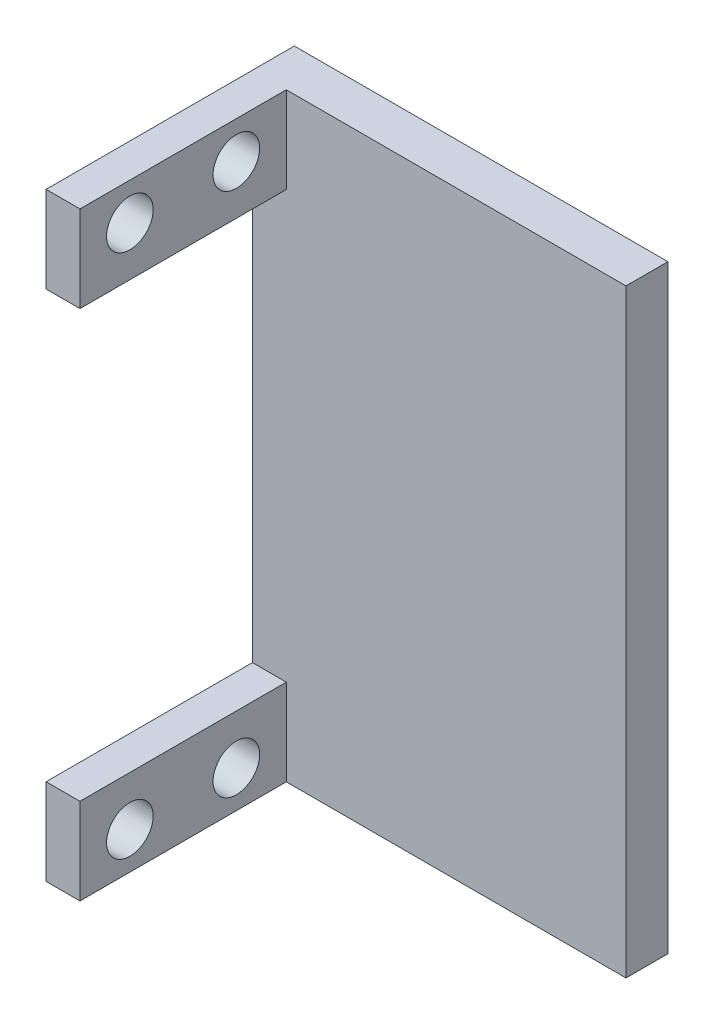
ISO-10303-21;
HEADER;
FILE_DESCRIPTION(('STEP AP214'),'2;1');
FILE_NAME('part.step','',(''),(''),'','','');
FILE_SCHEMA(('AUTOMOTIVE_DESIGN { 1 0 10303 214 1 1 1 1 }'));
ENDSEC;
DATA;
#1=APPLICATION_CONTEXT('core data for automotive mechanical design processes');
#2=APPLICATION_PROTOCOL_DEFINITION('international standard','automotive_design',2000,#1);
#3=PRODUCT_CONTEXT('',#1,'mechanical');
#4=PRODUCT('Part','Part','',(#3));
#5=PRODUCT_RELATED_PRODUCT_CATEGORY('part','',(#4));
#6=PRODUCT_DEFINITION_FORMATION('','',#4);
#7=PRODUCT_DEFINITION_CONTEXT('part definition',#1,'design');
#8=PRODUCT_DEFINITION('design','',#6,#7);
#9=PRODUCT_DEFINITION_SHAPE('','',#8);
#10=(LENGTH_UNIT() NAMED_UNIT(*) SI_UNIT(.MILLI.,.METRE.));
#11=(NAMED_UNIT(*) PLANE_ANGLE_UNIT() SI_UNIT($,.RADIAN.));
#12=(NAMED_UNIT(*) SI_UNIT($,.STERADIAN.) SOLID_ANGLE_UNIT());
#13=UNCERTAINTY_MEASURE_WITH_UNIT(LENGTH_MEASURE(1.E-05),#10,'distance_accuracy_value','');
#14=(GEOMETRIC_REPRESENTATION_CONTEXT(3) GLOBAL_UNCERTAINTY_ASSIGNED_CONTEXT((#13)) GLOBAL_UNIT_ASSIGNED_CONTEXT((#10,
#11,#12)) REPRESENTATION_CONTEXT('',''));
#15=CARTESIAN_POINT('',(0.,0.,0.));
#16=DIRECTION('',(0.,0.,1.));
#17=DIRECTION('',(1.,0.,0.));
#18=AXIS2_PLACEMENT_3D('',#15,#16,#17);
#19=CARTESIAN_POINT('',(0.,0.,2.));
#20=DIRECTION('',(0.,0.,1.));
#21=DIRECTION('',(1.,0.,0.));
#22=AXIS2_PLACEMENT_3D('',#19,#20,#21);
#23=PLANE('',#22);
#24=DIRECTION('',(0.,-1.,0.));
#25=VECTOR('',#24,1.);
#26=CARTESIAN_POINT('',(-15.3066683861169,28.6371621095774,2.));
#27=LINE('',#26,#25);
#28=CARTESIAN_POINT('',(-15.3066683861169,21.3981621095774,2.));
#29=VERTEX_POINT('',#28);
#30=CARTESIAN_POINT('',(-15.3066683861169,-19.3018378904226,2.));
#31=VERTEX_POINT('',#30);
#32=EDGE_CURVE('E49',#29,#31,#27,.T.);
#33=ORIENTED_EDGE('',*,*,#32,.T.);
#34=DIRECTION('',(-1.,0.,0.));
#35=VECTOR('',#34,1.);
#36=CARTESIAN_POINT('',(-15.3066683861169,-19.3018378904226,2.));
#37=LINE('',#36,#35);
#38=CARTESIAN_POINT('',(-12.075803956034,-19.3018378904226,2.));
#39=VERTEX_POINT('',#38);
#40=EDGE_CURVE('E57',#39,#31,#37,.T.);
#41=ORIENTED_EDGE('',*,*,#40,.F.);
#42=DIRECTION('',(0.,1.,0.));
#43=VECTOR('',#42,1.);
#44=CARTESIAN_POINT('',(-12.075803956034,-26.5408378904226,2.));
#45=LINE('',#44,#43);
#46=CARTESIAN_POINT('',(-12.075803956034,-27.5408378904226,2.));
#47=VERTEX_POINT('',#46);
#48=EDGE_CURVE('E204',#47,#39,#45,.T.);
#49=ORIENTED_EDGE('',*,*,#48,.F.);
#50=DIRECTION('',(-1.,0.,0.));
#51=VECTOR('',#50,1.);
#52=CARTESIAN_POINT('',(20.3293316138831,-27.5408378904226,2.));
#53=LINE('',#52,#51);
#54=CARTESIAN_POINT('',(20.3293316138831,-27.5408378904226,2.));
#55=VERTEX_POINT('',#54);
#56=EDGE_CURVE('E166',#55,#47,#53,.T.);
#57=ORIENTED_EDGE('',*,*,#56,.F.);
#58=DIRECTION('',(0.,1.,0.));
#59=VECTOR('',#58,1.);
#60=CARTESIAN_POINT('',(20.3293316138831,28.6371621095774,2.));
#61=LINE('',#60,#59);
#62=CARTESIAN_POINT('',(20.3293316138831,29.6371621095774,2.));
#63=VERTEX_POINT('',#62);
#64=EDGE_CURVE('E11',#55,#63,#61,.T.);
#65=ORIENTED_EDGE('',*,*,#64,.T.);
#66=DIRECTION('',(1.,0.,0.));
#67=VECTOR('',#66,1.);
#68=CARTESIAN_POINT('',(-12.075803956034,29.6371621095774,2.));
#69=LINE('',#68,#67);
#70=CARTESIAN_POINT('',(-12.075803956034,29.6371621095774,2.));
#71=VERTEX_POINT('',#70);
#72=EDGE_CURVE('E142',#71,#63,#69,.T.);
#73=ORIENTED_EDGE('',*,*,#72,.F.);
#74=DIRECTION('',(0.,1.,0.));
#75=VECTOR('',#74,1.);
#76=CARTESIAN_POINT('',(-12.075803956034,28.6371621095774,2.));
#77=LINE('',#76,#75);
#78=CARTESIAN_POINT('',(-12.075803956034,21.3981621095774,2.));
#79=VERTEX_POINT('',#78);
#80=EDGE_CURVE('E234',#79,#71,#77,.T.);
#81=ORIENTED_EDGE('',*,*,#80,.F.);
#82=DIRECTION('',(1.,0.,0.));
#83=VECTOR('',#82,1.);
#84=CARTESIAN_POINT('',(-15.3066683861169,21.3981621095774,2.));
#85=LINE('',#84,#83);
#86=EDGE_CURVE('E203',#29,#79,#85,.T.);
#87=ORIENTED_EDGE('',*,*,#86,.F.);
#88=EDGE_LOOP('',(#33,#41,#49,#57,#65,#73,#81,#87));
#89=FACE_BOUND('',#88,.T.);
#90=ADVANCED_FACE('F39',(#89),#23,.T.);
#91=CARTESIAN_POINT('',(-15.3066683861169,28.6371621095774,2.));
#92=DIRECTION('',(1.,0.,0.));
#93=DIRECTION('',(0.,1.,0.));
#94=AXIS2_PLACEMENT_3D('',#91,#92,#93);
#95=PLANE('',#94);
#96=CARTESIAN_POINT('',(-15.3066683861169,-24.0008378904226,16.9225));
#97=DIRECTION('',(-1.,0.,0.));
#98=DIRECTION('',(0.,-1.,0.));
#99=AXIS2_PLACEMENT_3D('',#96,#97,#98);
#100=CIRCLE('',#99,2.2225);
#101=CARTESIAN_POINT('',(-15.3066683861169,-26.2233378904226,16.9225));
#102=VERTEX_POINT('',#101);
#103=EDGE_CURVE('E183',#102,#102,#100,.T.);
#104=ORIENTED_EDGE('',*,*,#103,.F.);
#105=EDGE_LOOP('',(#104));
#106=FACE_BOUND('',#105,.T.);
#107=CARTESIAN_POINT('',(-15.3066683861169,26.0971621095774,6.76249999999999));
#108=DIRECTION('',(-1.,0.,0.));
#109=DIRECTION('',(0.,-1.,0.));
#110=AXIS2_PLACEMENT_3D('',#107,#108,#109);
#111=CIRCLE('',#110,2.2225);
#112=CARTESIAN_POINT('',(-15.3066683861169,23.8746621095774,6.76249999999999));
#113=VERTEX_POINT('',#112);
#114=EDGE_CURVE('E182',#113,#113,#111,.T.);
#115=ORIENTED_EDGE('',*,*,#114,.F.);
#116=EDGE_LOOP('',(#115));
#117=FACE_BOUND('',#116,.T.);
#118=CARTESIAN_POINT('',(-15.3066683861169,-24.0008378904226,6.76249999999999));
#119=DIRECTION('',(-1.,0.,0.));
#120=DIRECTION('',(0.,-1.,0.));
#121=AXIS2_PLACEMENT_3D('',#118,#119,#120);
#122=CIRCLE('',#121,2.2225);
#123=CARTESIAN_POINT('',(-15.3066683861169,-26.2233378904226,6.76249999999999));
#124=VERTEX_POINT('',#123);
#125=EDGE_CURVE('E178',#124,#124,#122,.T.);
#126=ORIENTED_EDGE('',*,*,#125,.F.);
#127=EDGE_LOOP('',(#126));
#128=FACE_BOUND('',#127,.T.);
#129=CARTESIAN_POINT('',(-15.3066683861169,26.0971621095774,16.9225));
#130=DIRECTION('',(-1.,0.,0.));
#131=DIRECTION('',(0.,-1.,0.));
#132=AXIS2_PLACEMENT_3D('',#129,#130,#131);
#133=CIRCLE('',#132,2.2225);
#134=CARTESIAN_POINT('',(-15.3066683861169,23.8746621095774,16.9225));
#135=VERTEX_POINT('',#134);
#136=EDGE_CURVE('E187',#135,#135,#133,.T.);
#137=ORIENTED_EDGE('',*,*,#136,.F.);
#138=EDGE_LOOP('',(#137));
#139=FACE_BOUND('',#138,.T.);
#140=DIRECTION('',(0.,-1.,0.));
#141=VECTOR('',#140,1.);
#142=CARTESIAN_POINT('',(-15.3066683861169,28.6371621095774,-2.));
#143=LINE('',#142,#141);
#144=CARTESIAN_POINT('',(-15.3066683861169,29.6371621095774,-2.));
#145=VERTEX_POINT('',#144);
#146=CARTESIAN_POINT('',(-15.3066683861169,-27.5408378904226,-2.));
#147=VERTEX_POINT('',#146);
#148=EDGE_CURVE('E127',#145,#147,#143,.T.);
#149=ORIENTED_EDGE('',*,*,#148,.T.);
#150=DIRECTION('',(0.,0.,-1.));
#151=VECTOR('',#150,1.);
#152=CARTESIAN_POINT('',(-15.3066683861169,-27.5408378904226,21.685));
#153=LINE('',#152,#151);
#154=CARTESIAN_POINT('',(-15.3066683861169,-27.5408378904226,21.685));
#155=VERTEX_POINT('',#154);
#156=EDGE_CURVE('E157',#155,#147,#153,.T.);
#157=ORIENTED_EDGE('',*,*,#156,.F.);
#158=DIRECTION('',(0.,1.,0.));
#159=VECTOR('',#158,1.);
#160=CARTESIAN_POINT('',(-15.3066683861169,-26.5408378904226,21.685));
#161=LINE('',#160,#159);
#162=CARTESIAN_POINT('',(-15.3066683861169,-19.3018378904226,21.685));
#163=VERTEX_POINT('',#162);
#164=EDGE_CURVE('E198',#155,#163,#161,.T.);
#165=ORIENTED_EDGE('',*,*,#164,.T.);
#166=DIRECTION('',(0.,0.,-1.));
#167=VECTOR('',#166,1.);
#168=CARTESIAN_POINT('',(-15.3066683861169,-19.3018378904226,29.6122697674278));
#169=LINE('',#168,#167);
#170=EDGE_CURVE('E210',#163,#31,#169,.T.);
#171=ORIENTED_EDGE('',*,*,#170,.T.);
#172=ORIENTED_EDGE('',*,*,#32,.F.);
#173=DIRECTION('',(0.,0.,-1.));
#174=VECTOR('',#173,1.);
#175=CARTESIAN_POINT('',(-15.3066683861169,21.3981621095774,29.6122697674278));
#176=LINE('',#175,#174);
#177=CARTESIAN_POINT('',(-15.3066683861169,21.3981621095774,21.685));
#178=VERTEX_POINT('',#177);
#179=EDGE_CURVE('E224',#178,#29,#176,.T.);
#180=ORIENTED_EDGE('',*,*,#179,.F.);
#181=DIRECTION('',(0.,1.,0.));
#182=VECTOR('',#181,1.);
#183=CARTESIAN_POINT('',(-15.3066683861169,28.6371621095774,21.685));
#184=LINE('',#183,#182);
#185=CARTESIAN_POINT('',(-15.3066683861169,29.6371621095774,21.685));
#186=VERTEX_POINT('',#185);
#187=EDGE_CURVE('E228',#178,#186,#184,.T.);
#188=ORIENTED_EDGE('',*,*,#187,.T.);
#189=DIRECTION('',(0.,0.,1.));
#190=VECTOR('',#189,1.);
#191=CARTESIAN_POINT('',(-15.3066683861169,29.6371621095774,-2.));
#192=LINE('',#191,#190);
#193=EDGE_CURVE('E136',#145,#186,#192,.T.);
#194=ORIENTED_EDGE('',*,*,#193,.F.);
#195=EDGE_LOOP('',(#149,#157,#165,#171,#172,#180,#188,#194));
#196=FACE_BOUND('',#195,.T.);
#197=ADVANCED_FACE('F41',(#106,#117,#128,#139,#196),#95,.F.);
#198=CARTESIAN_POINT('',(20.3293316138831,28.6371621095774,2.));
#199=DIRECTION('',(-1.,0.,0.));
#200=DIRECTION('',(0.,-1.,0.));
#201=AXIS2_PLACEMENT_3D('',#198,#199,#200);
#202=PLANE('',#201);
#203=DIRECTION('',(0.,1.,0.));
#204=VECTOR('',#203,1.);
#205=CARTESIAN_POINT('',(20.3293316138831,28.6371621095774,-2.));
#206=LINE('',#205,#204);
#207=CARTESIAN_POINT('',(20.3293316138831,-27.5408378904226,-2.));
#208=VERTEX_POINT('',#207);
#209=CARTESIAN_POINT('',(20.3293316138831,29.6371621095774,-2.));
#210=VERTEX_POINT('',#209);
#211=EDGE_CURVE('E116',#208,#210,#206,.T.);
#212=ORIENTED_EDGE('',*,*,#211,.T.);
#213=DIRECTION('',(0.,0.,-1.));
#214=VECTOR('',#213,1.);
#215=CARTESIAN_POINT('',(20.3293316138831,29.6371621095774,2.));
#216=LINE('',#215,#214);
#217=EDGE_CURVE('E120',#63,#210,#216,.T.);
#218=ORIENTED_EDGE('',*,*,#217,.F.);
#219=ORIENTED_EDGE('',*,*,#64,.F.);
#220=DIRECTION('',(0.,0.,1.));
#221=VECTOR('',#220,1.);
#222=CARTESIAN_POINT('',(20.3293316138831,-27.5408378904226,-2.));
#223=LINE('',#222,#221);
#224=EDGE_CURVE('E122',#208,#55,#223,.T.);
#225=ORIENTED_EDGE('',*,*,#224,.F.);
#226=EDGE_LOOP('',(#212,#218,#219,#225));
#227=FACE_BOUND('',#226,.T.);
#228=ADVANCED_FACE('F118',(#227),#202,.F.);
#229=CARTESIAN_POINT('',(0.,0.,-2.));
#230=DIRECTION('',(0.,0.,1.));
#231=DIRECTION('',(1.,0.,0.));
#232=AXIS2_PLACEMENT_3D('',#229,#230,#231);
#233=PLANE('',#232);
#234=ORIENTED_EDGE('',*,*,#148,.F.);
#235=DIRECTION('',(-1.,0.,0.));
#236=VECTOR('',#235,1.);
#237=CARTESIAN_POINT('',(20.3293316138831,29.6371621095774,-2.));
#238=LINE('',#237,#236);
#239=EDGE_CURVE('E130',#210,#145,#238,.T.);
#240=ORIENTED_EDGE('',*,*,#239,.F.);
#241=ORIENTED_EDGE('',*,*,#211,.F.);
#242=DIRECTION('',(1.,0.,0.));
#243=VECTOR('',#242,1.);
#244=CARTESIAN_POINT('',(-15.3066683861169,-27.5408378904226,-2.));
#245=LINE('',#244,#243);
#246=EDGE_CURVE('E161',#147,#208,#245,.T.);
#247=ORIENTED_EDGE('',*,*,#246,.F.);
#248=EDGE_LOOP('',(#234,#240,#241,#247));
#249=FACE_BOUND('',#248,.T.);
#250=ADVANCED_FACE('F131',(#249),#233,.F.);
#251=CARTESIAN_POINT('',(-12.075803956034,28.6371621095774,29.6122697674278));
#252=DIRECTION('',(-1.,0.,0.));
#253=DIRECTION('',(0.,0.,1.));
#254=AXIS2_PLACEMENT_3D('',#251,#252,#253);
#255=PLANE('',#254);
#256=CARTESIAN_POINT('',(-12.075803956034,26.0971621095774,6.76249999999999));
#257=DIRECTION('',(-1.,0.,0.));
#258=DIRECTION('',(0.,0.,1.));
#259=AXIS2_PLACEMENT_3D('',#256,#257,#258);
#260=CIRCLE('',#259,2.2225);
#261=CARTESIAN_POINT('',(-12.075803956034,26.0971621095774,8.98499999999999));
#262=VERTEX_POINT('',#261);
#263=EDGE_CURVE('E43',#262,#262,#260,.T.);
#264=ORIENTED_EDGE('',*,*,#263,.T.);
#265=EDGE_LOOP('',(#264));
#266=FACE_BOUND('',#265,.T.);
#267=CARTESIAN_POINT('',(-12.075803956034,26.0971621095774,16.9225));
#268=DIRECTION('',(-1.,0.,0.));
#269=DIRECTION('',(0.,0.,1.));
#270=AXIS2_PLACEMENT_3D('',#267,#268,#269);
#271=CIRCLE('',#270,2.2225);
#272=CARTESIAN_POINT('',(-12.075803956034,26.0971621095774,19.145));
#273=VERTEX_POINT('',#272);
#274=EDGE_CURVE('E254',#273,#273,#271,.T.);
#275=ORIENTED_EDGE('',*,*,#274,.T.);
#276=EDGE_LOOP('',(#275));
#277=FACE_BOUND('',#276,.T.);
#278=ORIENTED_EDGE('',*,*,#80,.T.);
#279=DIRECTION('',(0.,0.,-1.));
#280=VECTOR('',#279,1.);
#281=CARTESIAN_POINT('',(-12.075803956034,29.6371621095774,21.685));
#282=LINE('',#281,#280);
#283=CARTESIAN_POINT('',(-12.075803956034,29.6371621095774,21.685));
#284=VERTEX_POINT('',#283);
#285=EDGE_CURVE('E152',#284,#71,#282,.T.);
#286=ORIENTED_EDGE('',*,*,#285,.F.);
#287=DIRECTION('',(0.,-1.,0.));
#288=VECTOR('',#287,1.);
#289=CARTESIAN_POINT('',(-12.075803956034,28.6371621095774,21.685));
#290=LINE('',#289,#288);
#291=CARTESIAN_POINT('',(-12.075803956034,21.3981621095774,21.685));
#292=VERTEX_POINT('',#291);
#293=EDGE_CURVE('E219',#284,#292,#290,.T.);
#294=ORIENTED_EDGE('',*,*,#293,.T.);
#295=DIRECTION('',(0.,0.,-1.));
#296=VECTOR('',#295,1.);
#297=CARTESIAN_POINT('',(-12.075803956034,21.3981621095774,29.6122697674278));
#298=LINE('',#297,#296);
#299=EDGE_CURVE('E237',#292,#79,#298,.T.);
#300=ORIENTED_EDGE('',*,*,#299,.T.);
#301=EDGE_LOOP('',(#278,#286,#294,#300));
#302=FACE_BOUND('',#301,.T.);
#303=ADVANCED_FACE('F263',(#266,#277,#302),#255,.F.);
#304=CARTESIAN_POINT('',(-15.3066683861169,21.3981621095774,29.6122697674278));
#305=DIRECTION('',(0.,1.,0.));
#306=DIRECTION('',(0.,0.,1.));
#307=AXIS2_PLACEMENT_3D('',#304,#305,#306);
#308=PLANE('',#307);
#309=ORIENTED_EDGE('',*,*,#299,.F.);
#310=DIRECTION('',(-1.,0.,0.));
#311=VECTOR('',#310,1.);
#312=CARTESIAN_POINT('',(-15.3066683861169,21.3981621095774,21.685));
#313=LINE('',#312,#311);
#314=EDGE_CURVE('E223',#292,#178,#313,.T.);
#315=ORIENTED_EDGE('',*,*,#314,.T.);
#316=ORIENTED_EDGE('',*,*,#179,.T.);
#317=ORIENTED_EDGE('',*,*,#86,.T.);
#318=EDGE_LOOP('',(#309,#315,#316,#317));
#319=FACE_BOUND('',#318,.T.);
#320=ADVANCED_FACE('F289',(#319),#308,.F.);
#321=CARTESIAN_POINT('',(-14.9256683861169,20.6361621095774,21.685));
#322=DIRECTION('',(0.,0.,-1.));
#323=DIRECTION('',(1.,0.,0.));
#324=AXIS2_PLACEMENT_3D('',#321,#322,#323);
#325=PLANE('',#324);
#326=ORIENTED_EDGE('',*,*,#314,.F.);
#327=ORIENTED_EDGE('',*,*,#293,.F.);
#328=DIRECTION('',(1.,0.,0.));
#329=VECTOR('',#328,1.);
#330=CARTESIAN_POINT('',(-15.3066683861169,29.6371621095774,21.685));
#331=LINE('',#330,#329);
#332=EDGE_CURVE('E148',#186,#284,#331,.T.);
#333=ORIENTED_EDGE('',*,*,#332,.F.);
#334=ORIENTED_EDGE('',*,*,#187,.F.);
#335=EDGE_LOOP('',(#326,#327,#333,#334));
#336=FACE_BOUND('',#335,.T.);
#337=ADVANCED_FACE('F313',(#336),#325,.F.);
#338=CARTESIAN_POINT('',(-15.3066683861169,-19.3018378904226,29.6122697674278));
#339=DIRECTION('',(0.,-1.,0.));
#340=DIRECTION('',(0.,0.,-1.));
#341=AXIS2_PLACEMENT_3D('',#338,#339,#340);
#342=PLANE('',#341);
#343=ORIENTED_EDGE('',*,*,#170,.F.);
#344=DIRECTION('',(1.,0.,0.));
#345=VECTOR('',#344,1.);
#346=CARTESIAN_POINT('',(-15.3066683861169,-19.3018378904226,21.685));
#347=LINE('',#346,#345);
#348=CARTESIAN_POINT('',(-12.075803956034,-19.3018378904226,21.685));
#349=VERTEX_POINT('',#348);
#350=EDGE_CURVE('E199',#163,#349,#347,.T.);
#351=ORIENTED_EDGE('',*,*,#350,.T.);
#352=DIRECTION('',(0.,0.,-1.));
#353=VECTOR('',#352,1.);
#354=CARTESIAN_POINT('',(-12.075803956034,-19.3018378904226,29.6122697674278));
#355=LINE('',#354,#353);
#356=EDGE_CURVE('E213',#349,#39,#355,.T.);
#357=ORIENTED_EDGE('',*,*,#356,.T.);
#358=ORIENTED_EDGE('',*,*,#40,.T.);
#359=EDGE_LOOP('',(#343,#351,#357,#358));
#360=FACE_BOUND('',#359,.T.);
#361=ADVANCED_FACE('F320',(#360),#342,.F.);
#362=CARTESIAN_POINT('',(-12.075803956034,-26.5408378904226,29.6122697674278));
#363=DIRECTION('',(-1.,0.,0.));
#364=DIRECTION('',(0.,0.,1.));
#365=AXIS2_PLACEMENT_3D('',#362,#363,#364);
#366=PLANE('',#365);
#367=CARTESIAN_POINT('',(-12.075803956034,-24.0008378904226,16.9225));
#368=DIRECTION('',(-1.,0.,0.));
#369=DIRECTION('',(0.,0.,1.));
#370=AXIS2_PLACEMENT_3D('',#367,#368,#369);
#371=CIRCLE('',#370,2.2225);
#372=CARTESIAN_POINT('',(-12.075803956034,-24.0008378904226,19.145));
#373=VERTEX_POINT('',#372);
#374=EDGE_CURVE('E251',#373,#373,#371,.T.);
#375=ORIENTED_EDGE('',*,*,#374,.T.);
#376=EDGE_LOOP('',(#375));
#377=FACE_BOUND('',#376,.T.);
#378=CARTESIAN_POINT('',(-12.075803956034,-24.0008378904226,6.76249999999999));
#379=DIRECTION('',(-1.,0.,0.));
#380=DIRECTION('',(0.,0.,1.));
#381=AXIS2_PLACEMENT_3D('',#378,#379,#380);
#382=CIRCLE('',#381,2.2225);
#383=CARTESIAN_POINT('',(-12.075803956034,-24.0008378904226,8.98499999999999));
#384=VERTEX_POINT('',#383);
#385=EDGE_CURVE('E194',#384,#384,#382,.T.);
#386=ORIENTED_EDGE('',*,*,#385,.T.);
#387=EDGE_LOOP('',(#386));
#388=FACE_BOUND('',#387,.T.);
#389=ORIENTED_EDGE('',*,*,#356,.F.);
#390=DIRECTION('',(0.,-1.,0.));
#391=VECTOR('',#390,1.);
#392=CARTESIAN_POINT('',(-12.075803956034,-26.5408378904226,21.685));
#393=LINE('',#392,#391);
#394=CARTESIAN_POINT('',(-12.075803956034,-27.5408378904226,21.685));
#395=VERTEX_POINT('',#394);
#396=EDGE_CURVE('E195',#349,#395,#393,.T.);
#397=ORIENTED_EDGE('',*,*,#396,.T.);
#398=DIRECTION('',(0.,0.,1.));
#399=VECTOR('',#398,1.);
#400=CARTESIAN_POINT('',(-12.075803956034,-27.5408378904226,2.));
#401=LINE('',#400,#399);
#402=EDGE_CURVE('E170',#47,#395,#401,.T.);
#403=ORIENTED_EDGE('',*,*,#402,.F.);
#404=ORIENTED_EDGE('',*,*,#48,.T.);
#405=EDGE_LOOP('',(#389,#397,#403,#404));
#406=FACE_BOUND('',#405,.T.);
#407=ADVANCED_FACE('F328',(#377,#388,#406),#366,.F.);
#408=CARTESIAN_POINT('',(-14.9256683861169,20.6361621095774,21.685));
#409=DIRECTION('',(0.,0.,-1.));
#410=DIRECTION('',(1.,0.,0.));
#411=AXIS2_PLACEMENT_3D('',#408,#409,#410);
#412=PLANE('',#411);
#413=ORIENTED_EDGE('',*,*,#164,.F.);
#414=DIRECTION('',(-1.,0.,0.));
#415=VECTOR('',#414,1.);
#416=CARTESIAN_POINT('',(-12.075803956034,-27.5408378904226,21.685));
#417=LINE('',#416,#415);
#418=EDGE_CURVE('E174',#395,#155,#417,.T.);
#419=ORIENTED_EDGE('',*,*,#418,.F.);
#420=ORIENTED_EDGE('',*,*,#396,.F.);
#421=ORIENTED_EDGE('',*,*,#350,.F.);
#422=EDGE_LOOP('',(#413,#419,#420,#421));
#423=FACE_BOUND('',#422,.T.);
#424=ADVANCED_FACE('F337',(#423),#412,.F.);
#425=CARTESIAN_POINT('',(20.3293316138831,-24.0008378904226,6.76249999999999));
#426=DIRECTION('',(-1.,0.,0.));
#427=DIRECTION('',(0.,-1.,0.));
#428=AXIS2_PLACEMENT_3D('',#425,#426,#427);
#429=CYLINDRICAL_SURFACE('',#428,2.2225);
#430=ORIENTED_EDGE('',*,*,#125,.T.);
#431=EDGE_LOOP('',(#430));
#432=FACE_BOUND('',#431,.T.);
#433=ORIENTED_EDGE('',*,*,#385,.F.);
#434=EDGE_LOOP('',(#433));
#435=FACE_BOUND('',#434,.T.);
#436=ADVANCED_FACE('F345',(#432,#435),#429,.F.);
#437=CARTESIAN_POINT('',(20.3293316138831,-24.0008378904226,16.9225));
#438=DIRECTION('',(-1.,0.,0.));
#439=DIRECTION('',(0.,-1.,0.));
#440=AXIS2_PLACEMENT_3D('',#437,#438,#439);
#441=CYLINDRICAL_SURFACE('',#440,2.2225);
#442=ORIENTED_EDGE('',*,*,#103,.T.);
#443=EDGE_LOOP('',(#442));
#444=FACE_BOUND('',#443,.T.);
#445=ORIENTED_EDGE('',*,*,#374,.F.);
#446=EDGE_LOOP('',(#445));
#447=FACE_BOUND('',#446,.T.);
#448=ADVANCED_FACE('F277',(#444,#447),#441,.F.);
#449=CARTESIAN_POINT('',(20.3293316138831,26.0971621095774,16.9225));
#450=DIRECTION('',(-1.,0.,0.));
#451=DIRECTION('',(0.,-1.,0.));
#452=AXIS2_PLACEMENT_3D('',#449,#450,#451);
#453=CYLINDRICAL_SURFACE('',#452,2.2225);
#454=ORIENTED_EDGE('',*,*,#136,.T.);
#455=EDGE_LOOP('',(#454));
#456=FACE_BOUND('',#455,.T.);
#457=ORIENTED_EDGE('',*,*,#274,.F.);
#458=EDGE_LOOP('',(#457));
#459=FACE_BOUND('',#458,.T.);
#460=ADVANCED_FACE('F268',(#456,#459),#453,.F.);
#461=CARTESIAN_POINT('',(20.3293316138831,26.0971621095774,6.76249999999999));
#462=DIRECTION('',(-1.,0.,0.));
#463=DIRECTION('',(0.,-1.,0.));
#464=AXIS2_PLACEMENT_3D('',#461,#462,#463);
#465=CYLINDRICAL_SURFACE('',#464,2.2225);
#466=ORIENTED_EDGE('',*,*,#114,.T.);
#467=EDGE_LOOP('',(#466));
#468=FACE_BOUND('',#467,.T.);
#469=ORIENTED_EDGE('',*,*,#263,.F.);
#470=EDGE_LOOP('',(#469));
#471=FACE_BOUND('',#470,.T.);
#472=ADVANCED_FACE('F265',(#468,#471),#465,.F.);
#473=CARTESIAN_POINT('',(0.,-27.5408378904226,0.));
#474=DIRECTION('',(0.,-1.,0.));
#475=DIRECTION('',(0.,0.,-1.));
#476=AXIS2_PLACEMENT_3D('',#473,#474,#475);
#477=PLANE('',#476);
#478=ORIENTED_EDGE('',*,*,#156,.T.);
#479=ORIENTED_EDGE('',*,*,#246,.T.);
#480=ORIENTED_EDGE('',*,*,#224,.T.);
#481=ORIENTED_EDGE('',*,*,#56,.T.);
#482=ORIENTED_EDGE('',*,*,#402,.T.);
#483=ORIENTED_EDGE('',*,*,#418,.T.);
#484=EDGE_LOOP('',(#478,#479,#480,#481,#482,#483));
#485=FACE_BOUND('',#484,.T.);
#486=ADVANCED_FACE('F267',(#485),#477,.T.);
#487=CARTESIAN_POINT('',(0.,29.6371621095774,0.));
#488=DIRECTION('',(0.,1.,0.));
#489=DIRECTION('',(0.,0.,1.));
#490=AXIS2_PLACEMENT_3D('',#487,#488,#489);
#491=PLANE('',#490);
#492=ORIENTED_EDGE('',*,*,#217,.T.);
#493=ORIENTED_EDGE('',*,*,#239,.T.);
#494=ORIENTED_EDGE('',*,*,#193,.T.);
#495=ORIENTED_EDGE('',*,*,#332,.T.);
#496=ORIENTED_EDGE('',*,*,#285,.T.);
#497=ORIENTED_EDGE('',*,*,#72,.T.);
#498=EDGE_LOOP('',(#492,#493,#494,#495,#496,#497));
#499=FACE_BOUND('',#498,.T.);
#500=ADVANCED_FACE('F139',(#499),#491,.T.);
#501=CLOSED_SHELL('',(#90,#197,#228,#250,#303,#320,#337,#361,#407,#424,#436,#448,#460,#472,#486,#500));
#502=MANIFOLD_SOLID_BREP('B2',#501);
#503=ADVANCED_BREP_SHAPE_REPRESENTATION('',(#18,#502),#14);
#504=SHAPE_DEFINITION_REPRESENTATION(#9,#503);
ENDSEC;
END-ISO-10303-21;
